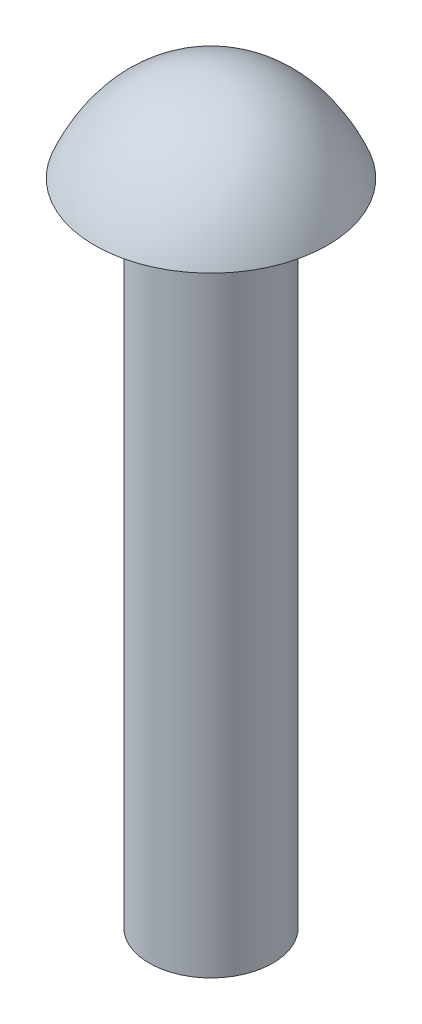
ISO-10303-21;
HEADER;
FILE_DESCRIPTION(('STEP AP214'),'2;1');
FILE_NAME('part.step','',(''),(''),'','','');
FILE_SCHEMA(('AUTOMOTIVE_DESIGN { 1 0 10303 214 1 1 1 1 }'));
ENDSEC;
DATA;
#1=APPLICATION_CONTEXT('core data for automotive mechanical design processes');
#2=APPLICATION_PROTOCOL_DEFINITION('international standard','automotive_design',2000,#1);
#3=PRODUCT_CONTEXT('',#1,'mechanical');
#4=PRODUCT('Part','Part','',(#3));
#5=PRODUCT_RELATED_PRODUCT_CATEGORY('part','',(#4));
#6=PRODUCT_DEFINITION_FORMATION('','',#4);
#7=PRODUCT_DEFINITION_CONTEXT('part definition',#1,'design');
#8=PRODUCT_DEFINITION('design','',#6,#7);
#9=PRODUCT_DEFINITION_SHAPE('','',#8);
#10=(LENGTH_UNIT() NAMED_UNIT(*) SI_UNIT(.MILLI.,.METRE.));
#11=(NAMED_UNIT(*) PLANE_ANGLE_UNIT() SI_UNIT($,.RADIAN.));
#12=(NAMED_UNIT(*) SI_UNIT($,.STERADIAN.) SOLID_ANGLE_UNIT());
#13=UNCERTAINTY_MEASURE_WITH_UNIT(LENGTH_MEASURE(1.E-05),#10,'distance_accuracy_value','');
#14=(GEOMETRIC_REPRESENTATION_CONTEXT(3) GLOBAL_UNCERTAINTY_ASSIGNED_CONTEXT((#13)) GLOBAL_UNIT_ASSIGNED_CONTEXT((#10,
#11,#12)) REPRESENTATION_CONTEXT('',''));
#15=CARTESIAN_POINT('',(0.,0.,0.));
#16=DIRECTION('',(0.,0.,1.));
#17=DIRECTION('',(1.,0.,0.));
#18=AXIS2_PLACEMENT_3D('',#15,#16,#17);
#19=CARTESIAN_POINT('',(-13.734350503054,25.4,0.));
#20=CARTESIAN_POINT('',(-13.9582844395624,25.946693156176,0.));
#21=CARTESIAN_POINT('',(-15.1773431520363,28.8798,0.));
#22=CARTESIAN_POINT('',(-18.293650503054,28.8798,0.));
#23=B_SPLINE_CURVE_WITH_KNOTS('',3,(#19,#20,#21,#22),.UNSPECIFIED.,.F.,.F.,(4,4),(0.,1.),.UNSPECIFIED.);
#24=CARTESIAN_POINT('',(-18.293650503054,0.,0.));
#25=DIRECTION('',(0.,-1.,0.));
#26=AXIS1_PLACEMENT('',#24,#25);
#27=SURFACE_OF_REVOLUTION('',#23,#26);
#28=CARTESIAN_POINT('',(-18.293650503054,28.8798,0.));
#29=VERTEX_POINT('',#28);
#30=VERTEX_LOOP('',#29);
#31=FACE_BOUND('',#30,.T.);
#32=CARTESIAN_POINT('',(-18.293650503054,25.4,0.));
#33=DIRECTION('',(0.,-1.,0.));
#34=DIRECTION('',(0.,0.,-1.));
#35=AXIS2_PLACEMENT_3D('',#32,#33,#34);
#36=CIRCLE('',#35,4.5593);
#37=CARTESIAN_POINT('',(-18.293650503054,25.4,-4.5593));
#38=VERTEX_POINT('',#37);
#39=EDGE_CURVE('E11',#38,#38,#36,.T.);
#40=ORIENTED_EDGE('',*,*,#39,.F.);
#41=EDGE_LOOP('',(#40));
#42=FACE_BOUND('',#41,.T.);
#43=ADVANCED_FACE('F39',(#31,#42),#27,.F.);
#44=CARTESIAN_POINT('',(-15.880650503054,25.4,0.));
#45=DIRECTION('',(0.,-1.,0.));
#46=DIRECTION('',(0.,0.,-1.));
#47=AXIS2_PLACEMENT_3D('',#44,#45,#46);
#48=PLANE('',#47);
#49=ORIENTED_EDGE('',*,*,#39,.T.);
#50=EDGE_LOOP('',(#49));
#51=FACE_BOUND('',#50,.T.);
#52=CARTESIAN_POINT('',(-18.293650503054,25.4,0.));
#53=DIRECTION('',(0.,-1.,0.));
#54=DIRECTION('',(0.,0.,-1.));
#55=AXIS2_PLACEMENT_3D('',#52,#53,#54);
#56=CIRCLE('',#55,2.413);
#57=CARTESIAN_POINT('',(-18.293650503054,25.4,-2.413));
#58=VERTEX_POINT('',#57);
#59=EDGE_CURVE('E47',#58,#58,#56,.T.);
#60=ORIENTED_EDGE('',*,*,#59,.F.);
#61=EDGE_LOOP('',(#60));
#62=FACE_BOUND('',#61,.T.);
#63=ADVANCED_FACE('F52',(#51,#62),#48,.T.);
#64=CARTESIAN_POINT('',(-18.293650503054,0.,0.));
#65=DIRECTION('',(0.,-1.,0.));
#66=DIRECTION('',(0.,0.,-1.));
#67=AXIS2_PLACEMENT_3D('',#64,#65,#66);
#68=CYLINDRICAL_SURFACE('',#67,2.413);
#69=ORIENTED_EDGE('',*,*,#59,.T.);
#70=EDGE_LOOP('',(#69));
#71=FACE_BOUND('',#70,.T.);
#72=CARTESIAN_POINT('',(-18.293650503054,0.,0.));
#73=DIRECTION('',(0.,-1.,0.));
#74=DIRECTION('',(0.,0.,-1.));
#75=AXIS2_PLACEMENT_3D('',#72,#73,#74);
#76=CIRCLE('',#75,2.413);
#77=CARTESIAN_POINT('',(-18.293650503054,0.,-2.413));
#78=VERTEX_POINT('',#77);
#79=EDGE_CURVE('E62',#78,#78,#76,.T.);
#80=ORIENTED_EDGE('',*,*,#79,.F.);
#81=EDGE_LOOP('',(#80));
#82=FACE_BOUND('',#81,.T.);
#83=ADVANCED_FACE('F57',(#71,#82),#68,.T.);
#84=CARTESIAN_POINT('',(-18.293650503054,0.,0.));
#85=DIRECTION('',(0.,-1.,0.));
#86=DIRECTION('',(0.,0.,-1.));
#87=AXIS2_PLACEMENT_3D('',#84,#85,#86);
#88=PLANE('',#87);
#89=ORIENTED_EDGE('',*,*,#79,.T.);
#90=EDGE_LOOP('',(#89));
#91=FACE_BOUND('',#90,.T.);
#92=ADVANCED_FACE('F74',(#91),#88,.T.);
#93=CLOSED_SHELL('',(#43,#63,#83,#92));
#94=MANIFOLD_SOLID_BREP('B2',#93);
#95=ADVANCED_BREP_SHAPE_REPRESENTATION('',(#18,#94),#14);
#96=SHAPE_DEFINITION_REPRESENTATION(#9,#95);
ENDSEC;
END-ISO-10303-21;
